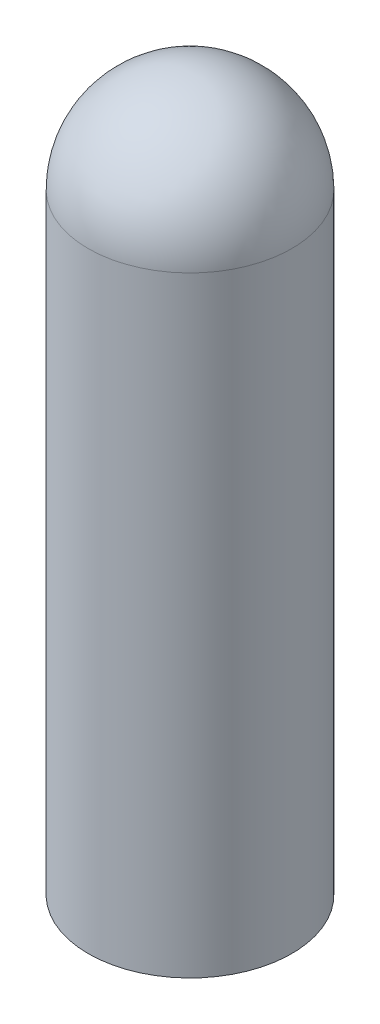
ISO-10303-21;
HEADER;
FILE_DESCRIPTION(('STEP AP214'),'2;1');
FILE_NAME('part.step','',(''),(''),'','','');
FILE_SCHEMA(('AUTOMOTIVE_DESIGN { 1 0 10303 214 1 1 1 1 }'));
ENDSEC;
DATA;
#1=APPLICATION_CONTEXT('core data for automotive mechanical design processes');
#2=APPLICATION_PROTOCOL_DEFINITION('international standard','automotive_design',2000,#1);
#3=PRODUCT_CONTEXT('',#1,'mechanical');
#4=PRODUCT('Part','Part','',(#3));
#5=PRODUCT_RELATED_PRODUCT_CATEGORY('part','',(#4));
#6=PRODUCT_DEFINITION_FORMATION('','',#4);
#7=PRODUCT_DEFINITION_CONTEXT('part definition',#1,'design');
#8=PRODUCT_DEFINITION('design','',#6,#7);
#9=PRODUCT_DEFINITION_SHAPE('','',#8);
#10=(LENGTH_UNIT() NAMED_UNIT(*) SI_UNIT(.MILLI.,.METRE.));
#11=(NAMED_UNIT(*) PLANE_ANGLE_UNIT() SI_UNIT($,.RADIAN.));
#12=(NAMED_UNIT(*) SI_UNIT($,.STERADIAN.) SOLID_ANGLE_UNIT());
#13=UNCERTAINTY_MEASURE_WITH_UNIT(LENGTH_MEASURE(1.E-05),#10,'distance_accuracy_value','');
#14=(GEOMETRIC_REPRESENTATION_CONTEXT(3) GLOBAL_UNCERTAINTY_ASSIGNED_CONTEXT((#13)) GLOBAL_UNIT_ASSIGNED_CONTEXT((#10,
#11,#12)) REPRESENTATION_CONTEXT('',''));
#15=CARTESIAN_POINT('',(0.,0.,0.));
#16=DIRECTION('',(0.,0.,1.));
#17=DIRECTION('',(1.,0.,0.));
#18=AXIS2_PLACEMENT_3D('',#15,#16,#17);
#19=CARTESIAN_POINT('',(0.,152.4,0.));
#20=DIRECTION('',(0.,-1.,0.));
#21=DIRECTION('',(0.,0.,-1.));
#22=AXIS2_PLACEMENT_3D('',#19,#20,#21);
#23=CYLINDRICAL_SURFACE('',#22,25.4);
#24=CARTESIAN_POINT('',(0.,152.4,0.));
#25=DIRECTION('',(0.,1.,0.));
#26=DIRECTION('',(0.,0.,1.));
#27=AXIS2_PLACEMENT_3D('',#24,#25,#26);
#28=CIRCLE('',#27,25.4);
#29=CARTESIAN_POINT('',(0.,152.4,-25.4));
#30=VERTEX_POINT('',#29);
#31=EDGE_CURVE('E10',#30,#30,#28,.T.);
#32=CARTESIAN_POINT('',(0.,0.,0.));
#33=DIRECTION('',(0.,1.,0.));
#34=DIRECTION('',(0.,0.,1.));
#35=AXIS2_PLACEMENT_3D('',#32,#33,#34);
#36=CIRCLE('',#35,25.4);
#37=CARTESIAN_POINT('',(0.,0.,-25.4));
#38=VERTEX_POINT('',#37);
#39=EDGE_CURVE('E34',#38,#38,#36,.T.);
#40=CARTESIAN_POINT('',(0.,152.4,-25.4));
#41=CARTESIAN_POINT('',(0.,150.8125,-25.4));
#42=CARTESIAN_POINT('',(0.,149.225,-25.4));
#43=CARTESIAN_POINT('',(0.,146.05,-25.4));
#44=CARTESIAN_POINT('',(0.,144.4625,-25.4));
#45=CARTESIAN_POINT('',(0.,141.2875,-25.4));
#46=CARTESIAN_POINT('',(0.,139.7,-25.4));
#47=CARTESIAN_POINT('',(0.,136.525,-25.4));
#48=CARTESIAN_POINT('',(0.,134.9375,-25.4));
#49=CARTESIAN_POINT('',(0.,131.7625,-25.4));
#50=CARTESIAN_POINT('',(0.,130.175,-25.4));
#51=CARTESIAN_POINT('',(0.,127.,-25.4));
#52=CARTESIAN_POINT('',(0.,125.4125,-25.4));
#53=CARTESIAN_POINT('',(0.,122.2375,-25.4));
#54=CARTESIAN_POINT('',(0.,120.65,-25.4));
#55=CARTESIAN_POINT('',(0.,117.475,-25.4));
#56=CARTESIAN_POINT('',(0.,115.8875,-25.4));
#57=CARTESIAN_POINT('',(0.,112.7125,-25.4));
#58=CARTESIAN_POINT('',(0.,111.125,-25.4));
#59=CARTESIAN_POINT('',(0.,107.95,-25.4));
#60=CARTESIAN_POINT('',(0.,106.3625,-25.4));
#61=CARTESIAN_POINT('',(0.,103.1875,-25.4));
#62=CARTESIAN_POINT('',(0.,101.6,-25.4));
#63=CARTESIAN_POINT('',(0.,98.425,-25.4));
#64=CARTESIAN_POINT('',(0.,96.8375,-25.4));
#65=CARTESIAN_POINT('',(0.,93.6625,-25.4));
#66=CARTESIAN_POINT('',(0.,92.075,-25.4));
#67=CARTESIAN_POINT('',(0.,88.9,-25.4));
#68=CARTESIAN_POINT('',(0.,87.3125,-25.4));
#69=CARTESIAN_POINT('',(0.,84.1375,-25.4));
#70=CARTESIAN_POINT('',(0.,82.55,-25.4));
#71=CARTESIAN_POINT('',(0.,79.375,-25.4));
#72=CARTESIAN_POINT('',(0.,77.7875,-25.4));
#73=CARTESIAN_POINT('',(0.,74.6125,-25.4));
#74=CARTESIAN_POINT('',(0.,73.025,-25.4));
#75=CARTESIAN_POINT('',(0.,69.85,-25.4));
#76=CARTESIAN_POINT('',(0.,68.2625,-25.4));
#77=CARTESIAN_POINT('',(0.,65.0875,-25.4));
#78=CARTESIAN_POINT('',(0.,63.5,-25.4));
#79=CARTESIAN_POINT('',(0.,60.325,-25.4));
#80=CARTESIAN_POINT('',(0.,58.7375,-25.4));
#81=CARTESIAN_POINT('',(0.,55.5625,-25.4));
#82=CARTESIAN_POINT('',(0.,53.975,-25.4));
#83=CARTESIAN_POINT('',(0.,50.8,-25.4));
#84=CARTESIAN_POINT('',(0.,49.2125,-25.4));
#85=CARTESIAN_POINT('',(0.,46.0375,-25.4));
#86=CARTESIAN_POINT('',(0.,44.45,-25.4));
#87=CARTESIAN_POINT('',(0.,41.275,-25.4));
#88=CARTESIAN_POINT('',(0.,39.6875,-25.4));
#89=CARTESIAN_POINT('',(0.,36.5125,-25.4));
#90=CARTESIAN_POINT('',(0.,34.925,-25.4));
#91=CARTESIAN_POINT('',(0.,31.75,-25.4));
#92=CARTESIAN_POINT('',(0.,30.1625,-25.4));
#93=CARTESIAN_POINT('',(0.,26.9875,-25.4));
#94=CARTESIAN_POINT('',(0.,25.4,-25.4));
#95=CARTESIAN_POINT('',(0.,22.225,-25.4));
#96=CARTESIAN_POINT('',(0.,20.6375,-25.4));
#97=CARTESIAN_POINT('',(0.,17.4625,-25.4));
#98=CARTESIAN_POINT('',(0.,15.875,-25.4));
#99=CARTESIAN_POINT('',(0.,12.7,-25.4));
#100=CARTESIAN_POINT('',(0.,11.1125,-25.4));
#101=CARTESIAN_POINT('',(0.,7.93750000000001,-25.4));
#102=CARTESIAN_POINT('',(0.,6.35,-25.4));
#103=CARTESIAN_POINT('',(0.,3.175,-25.4));
#104=CARTESIAN_POINT('',(0.,1.5875,-25.4));
#105=CARTESIAN_POINT('',(0.,0.,-25.4));
#106=B_SPLINE_CURVE_WITH_KNOTS('',3,(#40,#41,#42,#43,#44,#45,#46,#47,#48,#49,#50,#51,#52,#53,
#54,#55,#56,#57,#58,#59,#60,#61,#62,#63,#64,#65,#66,#67,#68,#69,#70,#71,#72,#73,#74,#75,#76,#77,
#78,#79,#80,#81,#82,#83,#84,#85,#86,#87,#88,#89,#90,#91,#92,#93,#94,#95,#96,#97,#98,#99,#100,
#101,#102,#103,#104,#105),.UNSPECIFIED.,.F.,.F.,(4,2,2,2,2,2,2,2,2,2,2,2,2,2,2,2,2,2,2,2,2,2,2,
2,2,2,2,2,2,2,2,2,4),(0.,4.76249999999998,9.52499999999998,14.2875,19.05,23.8125,28.575,33.3375,
38.1,42.8625,47.625,52.3875,57.15,61.9125,66.675,71.4375,76.2,80.9625,85.725,90.4875,95.25,
100.0125,104.775,109.5375,114.3,119.0625,123.825,128.5875,133.35,138.1125,142.875,147.6375,
152.4),.UNSPECIFIED.);
#107=EDGE_CURVE('BSEAM31',#30,#38,#106,.T.);
#108=ORIENTED_EDGE('',*,*,#31,.F.);
#109=ORIENTED_EDGE('',*,*,#39,.T.);
#110=ORIENTED_EDGE('',*,*,#107,.T.);
#111=ORIENTED_EDGE('',*,*,#107,.F.);
#112=EDGE_LOOP('',(#108,#110,#109,#111));
#113=FACE_BOUND('',#112,.T.);
#114=ADVANCED_FACE('F31',(#113),#23,.T.);
#115=CARTESIAN_POINT('',(0.,0.,0.));
#116=DIRECTION('',(0.,1.,0.));
#117=DIRECTION('',(0.,0.,1.));
#118=AXIS2_PLACEMENT_3D('',#115,#116,#117);
#119=PLANE('',#118);
#120=CARTESIAN_POINT('',(0.,0.,0.));
#121=DIRECTION('',(0.,-1.,0.));
#122=DIRECTION('',(0.,0.,-1.));
#123=AXIS2_PLACEMENT_3D('',#120,#121,#122);
#124=CIRCLE('',#123,6.35);
#125=CARTESIAN_POINT('',(0.,0.,-6.35));
#126=VERTEX_POINT('',#125);
#127=EDGE_CURVE('E43',#126,#126,#124,.T.);
#128=ORIENTED_EDGE('',*,*,#127,.F.);
#129=EDGE_LOOP('',(#128));
#130=FACE_BOUND('',#129,.T.);
#131=ORIENTED_EDGE('',*,*,#39,.F.);
#132=EDGE_LOOP('',(#131));
#133=FACE_BOUND('',#132,.T.);
#134=ADVANCED_FACE('F58',(#130,#133),#119,.F.);
#135=CARTESIAN_POINT('',(0.,152.4,0.));
#136=DIRECTION('',(0.,0.,-1.));
#137=DIRECTION('',(1.,0.,0.));
#138=AXIS2_PLACEMENT_3D('',#135,#136,#137);
#139=SPHERICAL_SURFACE('',#138,25.4);
#140=CARTESIAN_POINT('',(0.,152.4,0.));
#141=DIRECTION('',(0.,1.,0.));
#142=DIRECTION('',(0.,0.,1.));
#143=AXIS2_PLACEMENT_3D('',#140,#141,#142);
#144=SPHERICAL_SURFACE('',#143,25.4);
#145=ORIENTED_EDGE('',*,*,#31,.T.);
#146=EDGE_LOOP('',(#145));
#147=FACE_BOUND('',#146,.T.);
#148=ADVANCED_FACE('F54',(#147),#144,.T.);
#149=CARTESIAN_POINT('',(0.,175.26,0.));
#150=DIRECTION('',(0.,-1.,0.));
#151=DIRECTION('',(0.,0.,-1.));
#152=AXIS2_PLACEMENT_3D('',#149,#150,#151);
#153=CYLINDRICAL_SURFACE('',#152,6.35);
#154=CARTESIAN_POINT('',(0.,175.26,0.));
#155=DIRECTION('',(0.,-1.,0.));
#156=DIRECTION('',(0.,0.,-1.));
#157=AXIS2_PLACEMENT_3D('',#154,#155,#156);
#158=CIRCLE('',#157,6.35);
#159=CARTESIAN_POINT('',(0.,175.26,-6.35));
#160=VERTEX_POINT('',#159);
#161=EDGE_CURVE('E41',#160,#160,#158,.T.);
#162=ORIENTED_EDGE('',*,*,#161,.F.);
#163=EDGE_LOOP('',(#162));
#164=FACE_BOUND('',#163,.T.);
#165=ORIENTED_EDGE('',*,*,#127,.T.);
#166=EDGE_LOOP('',(#165));
#167=FACE_BOUND('',#166,.T.);
#168=ADVANCED_FACE('F51',(#164,#167),#153,.F.);
#169=CARTESIAN_POINT('',(0.,175.26,0.));
#170=DIRECTION('',(0.,-1.,0.));
#171=DIRECTION('',(0.,0.,-1.));
#172=AXIS2_PLACEMENT_3D('',#169,#170,#171);
#173=PLANE('',#172);
#174=ORIENTED_EDGE('',*,*,#161,.T.);
#175=EDGE_LOOP('',(#174));
#176=FACE_BOUND('',#175,.T.);
#177=ADVANCED_FACE('F49',(#176),#173,.T.);
#178=CLOSED_SHELL('',(#114,#134,#148,#168,#177));
#179=MANIFOLD_SOLID_BREP('B2',#178);
#180=ADVANCED_BREP_SHAPE_REPRESENTATION('',(#18,#179),#14);
#181=SHAPE_DEFINITION_REPRESENTATION(#9,#180);
ENDSEC;
END-ISO-10303-21;
